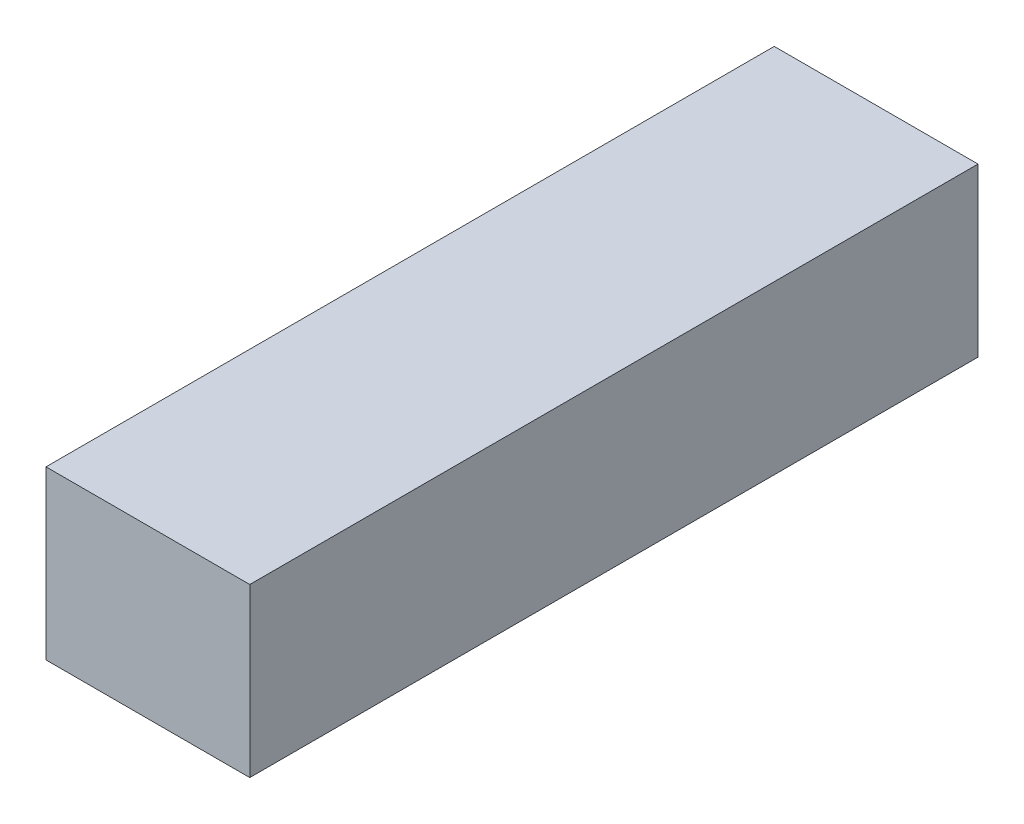
ISO-10303-21;
HEADER;
FILE_DESCRIPTION(('STEP AP214'),'2;1');
FILE_NAME('part.step','',(''),(''),'','','');
FILE_SCHEMA(('AUTOMOTIVE_DESIGN { 1 0 10303 214 1 1 1 1 }'));
ENDSEC;
DATA;
#1=APPLICATION_CONTEXT('core data for automotive mechanical design processes');
#2=APPLICATION_PROTOCOL_DEFINITION('international standard','automotive_design',2000,#1);
#3=PRODUCT_CONTEXT('',#1,'mechanical');
#4=PRODUCT('Part','Part','',(#3));
#5=PRODUCT_RELATED_PRODUCT_CATEGORY('part','',(#4));
#6=PRODUCT_DEFINITION_FORMATION('','',#4);
#7=PRODUCT_DEFINITION_CONTEXT('part definition',#1,'design');
#8=PRODUCT_DEFINITION('design','',#6,#7);
#9=PRODUCT_DEFINITION_SHAPE('','',#8);
#10=(LENGTH_UNIT() NAMED_UNIT(*) SI_UNIT(.MILLI.,.METRE.));
#11=(NAMED_UNIT(*) PLANE_ANGLE_UNIT() SI_UNIT($,.RADIAN.));
#12=(NAMED_UNIT(*) SI_UNIT($,.STERADIAN.) SOLID_ANGLE_UNIT());
#13=UNCERTAINTY_MEASURE_WITH_UNIT(LENGTH_MEASURE(1.E-05),#10,'distance_accuracy_value','');
#14=(GEOMETRIC_REPRESENTATION_CONTEXT(3) GLOBAL_UNCERTAINTY_ASSIGNED_CONTEXT((#13)) GLOBAL_UNIT_ASSIGNED_CONTEXT((#10,
#11,#12)) REPRESENTATION_CONTEXT('',''));
#15=CARTESIAN_POINT('',(0.,0.,0.));
#16=DIRECTION('',(0.,0.,1.));
#17=DIRECTION('',(1.,0.,0.));
#18=AXIS2_PLACEMENT_3D('',#15,#16,#17);
#19=CARTESIAN_POINT('',(69.9524051771872,57.4145833333333,500.));
#20=DIRECTION('',(-1.,0.,0.));
#21=DIRECTION('',(0.,0.,1.));
#22=AXIS2_PLACEMENT_3D('',#19,#20,#21);
#23=PLANE('',#22);
#24=DIRECTION('',(0.,1.,0.));
#25=VECTOR('',#24,1.);
#26=CARTESIAN_POINT('',(69.9524051771872,57.4145833333333,0.));
#27=LINE('',#26,#25);
#28=CARTESIAN_POINT('',(69.9524051771872,-57.4145833333333,0.));
#29=VERTEX_POINT('',#28);
#30=CARTESIAN_POINT('',(69.9524051771872,57.4145833333333,0.));
#31=VERTEX_POINT('',#30);
#32=EDGE_CURVE('E96',#29,#31,#27,.T.);
#33=ORIENTED_EDGE('',*,*,#32,.T.);
#34=DIRECTION('',(0.,0.,-1.));
#35=VECTOR('',#34,1.);
#36=CARTESIAN_POINT('',(69.9524051771872,57.4145833333333,500.));
#37=LINE('',#36,#35);
#38=CARTESIAN_POINT('',(69.9524051771872,57.4145833333333,500.));
#39=VERTEX_POINT('',#38);
#40=EDGE_CURVE('E11',#39,#31,#37,.T.);
#41=ORIENTED_EDGE('',*,*,#40,.F.);
#42=DIRECTION('',(0.,1.,0.));
#43=VECTOR('',#42,1.);
#44=CARTESIAN_POINT('',(69.9524051771872,57.4145833333333,500.));
#45=LINE('',#44,#43);
#46=CARTESIAN_POINT('',(69.9524051771872,-57.4145833333333,500.));
#47=VERTEX_POINT('',#46);
#48=EDGE_CURVE('E84',#47,#39,#45,.T.);
#49=ORIENTED_EDGE('',*,*,#48,.F.);
#50=DIRECTION('',(0.,0.,-1.));
#51=VECTOR('',#50,1.);
#52=CARTESIAN_POINT('',(69.9524051771872,-57.4145833333333,500.));
#53=LINE('',#52,#51);
#54=EDGE_CURVE('E92',#47,#29,#53,.T.);
#55=ORIENTED_EDGE('',*,*,#54,.T.);
#56=EDGE_LOOP('',(#33,#41,#49,#55));
#57=FACE_BOUND('',#56,.T.);
#58=ADVANCED_FACE('F33',(#57),#23,.F.);
#59=CARTESIAN_POINT('',(-69.9524051771872,57.4145833333333,500.));
#60=DIRECTION('',(0.,-1.,0.));
#61=DIRECTION('',(0.,0.,-1.));
#62=AXIS2_PLACEMENT_3D('',#59,#60,#61);
#63=PLANE('',#62);
#64=DIRECTION('',(-1.,0.,0.));
#65=VECTOR('',#64,1.);
#66=CARTESIAN_POINT('',(-69.9524051771872,57.4145833333333,0.));
#67=LINE('',#66,#65);
#68=CARTESIAN_POINT('',(-69.9524051771872,57.4145833333333,0.));
#69=VERTEX_POINT('',#68);
#70=EDGE_CURVE('E88',#31,#69,#67,.T.);
#71=ORIENTED_EDGE('',*,*,#70,.T.);
#72=DIRECTION('',(0.,0.,-1.));
#73=VECTOR('',#72,1.);
#74=CARTESIAN_POINT('',(-69.9524051771872,57.4145833333333,500.));
#75=LINE('',#74,#73);
#76=CARTESIAN_POINT('',(-69.9524051771872,57.4145833333333,500.));
#77=VERTEX_POINT('',#76);
#78=EDGE_CURVE('E41',#77,#69,#75,.T.);
#79=ORIENTED_EDGE('',*,*,#78,.F.);
#80=DIRECTION('',(-1.,0.,0.));
#81=VECTOR('',#80,1.);
#82=CARTESIAN_POINT('',(-69.9524051771872,57.4145833333333,500.));
#83=LINE('',#82,#81);
#84=EDGE_CURVE('E79',#39,#77,#83,.T.);
#85=ORIENTED_EDGE('',*,*,#84,.F.);
#86=ORIENTED_EDGE('',*,*,#40,.T.);
#87=EDGE_LOOP('',(#71,#79,#85,#86));
#88=FACE_BOUND('',#87,.T.);
#89=ADVANCED_FACE('F87',(#88),#63,.F.);
#90=CARTESIAN_POINT('',(-69.9524051771872,57.4145833333333,500.));
#91=DIRECTION('',(1.,0.,0.));
#92=DIRECTION('',(0.,0.,-1.));
#93=AXIS2_PLACEMENT_3D('',#90,#91,#92);
#94=PLANE('',#93);
#95=DIRECTION('',(0.,-1.,0.));
#96=VECTOR('',#95,1.);
#97=CARTESIAN_POINT('',(-69.9524051771872,57.4145833333333,0.));
#98=LINE('',#97,#96);
#99=CARTESIAN_POINT('',(-69.9524051771872,-57.4145833333333,0.));
#100=VERTEX_POINT('',#99);
#101=EDGE_CURVE('E66',#69,#100,#98,.T.);
#102=ORIENTED_EDGE('',*,*,#101,.T.);
#103=DIRECTION('',(0.,0.,-1.));
#104=VECTOR('',#103,1.);
#105=CARTESIAN_POINT('',(-69.9524051771872,-57.4145833333333,500.));
#106=LINE('',#105,#104);
#107=CARTESIAN_POINT('',(-69.9524051771872,-57.4145833333333,500.));
#108=VERTEX_POINT('',#107);
#109=EDGE_CURVE('E89',#108,#100,#106,.T.);
#110=ORIENTED_EDGE('',*,*,#109,.F.);
#111=DIRECTION('',(0.,-1.,0.));
#112=VECTOR('',#111,1.);
#113=CARTESIAN_POINT('',(-69.9524051771872,57.4145833333333,500.));
#114=LINE('',#113,#112);
#115=EDGE_CURVE('E82',#77,#108,#114,.T.);
#116=ORIENTED_EDGE('',*,*,#115,.F.);
#117=ORIENTED_EDGE('',*,*,#78,.T.);
#118=EDGE_LOOP('',(#102,#110,#116,#117));
#119=FACE_BOUND('',#118,.T.);
#120=ADVANCED_FACE('F90',(#119),#94,.F.);
#121=CARTESIAN_POINT('',(-69.9524051771872,-57.4145833333333,500.));
#122=DIRECTION('',(0.,1.,0.));
#123=DIRECTION('',(0.,0.,1.));
#124=AXIS2_PLACEMENT_3D('',#121,#122,#123);
#125=PLANE('',#124);
#126=DIRECTION('',(1.,0.,0.));
#127=VECTOR('',#126,1.);
#128=CARTESIAN_POINT('',(-69.9524051771872,-57.4145833333333,0.));
#129=LINE('',#128,#127);
#130=EDGE_CURVE('E72',#100,#29,#129,.T.);
#131=ORIENTED_EDGE('',*,*,#130,.T.);
#132=ORIENTED_EDGE('',*,*,#54,.F.);
#133=DIRECTION('',(1.,0.,0.));
#134=VECTOR('',#133,1.);
#135=CARTESIAN_POINT('',(-69.9524051771872,-57.4145833333333,500.));
#136=LINE('',#135,#134);
#137=EDGE_CURVE('E49',#108,#47,#136,.T.);
#138=ORIENTED_EDGE('',*,*,#137,.F.);
#139=ORIENTED_EDGE('',*,*,#109,.T.);
#140=EDGE_LOOP('',(#131,#132,#138,#139));
#141=FACE_BOUND('',#140,.T.);
#142=ADVANCED_FACE('F103',(#141),#125,.F.);
#143=CARTESIAN_POINT('',(0.,0.,500.));
#144=DIRECTION('',(0.,0.,1.));
#145=DIRECTION('',(1.,0.,0.));
#146=AXIS2_PLACEMENT_3D('',#143,#144,#145);
#147=PLANE('',#146);
#148=ORIENTED_EDGE('',*,*,#48,.T.);
#149=ORIENTED_EDGE('',*,*,#84,.T.);
#150=ORIENTED_EDGE('',*,*,#115,.T.);
#151=ORIENTED_EDGE('',*,*,#137,.T.);
#152=EDGE_LOOP('',(#148,#149,#150,#151));
#153=FACE_BOUND('',#152,.T.);
#154=ADVANCED_FACE('F80',(#153),#147,.T.);
#155=CARTESIAN_POINT('',(0.,0.,0.));
#156=DIRECTION('',(0.,0.,1.));
#157=DIRECTION('',(1.,0.,0.));
#158=AXIS2_PLACEMENT_3D('',#155,#156,#157);
#159=PLANE('',#158);
#160=ORIENTED_EDGE('',*,*,#32,.F.);
#161=ORIENTED_EDGE('',*,*,#130,.F.);
#162=ORIENTED_EDGE('',*,*,#101,.F.);
#163=ORIENTED_EDGE('',*,*,#70,.F.);
#164=EDGE_LOOP('',(#160,#161,#162,#163));
#165=FACE_BOUND('',#164,.T.);
#166=ADVANCED_FACE('F106',(#165),#159,.F.);
#167=CLOSED_SHELL('',(#58,#89,#120,#142,#154,#166));
#168=MANIFOLD_SOLID_BREP('B2',#167);
#169=ADVANCED_BREP_SHAPE_REPRESENTATION('',(#18,#168),#14);
#170=SHAPE_DEFINITION_REPRESENTATION(#9,#169);
ENDSEC;
END-ISO-10303-21;
